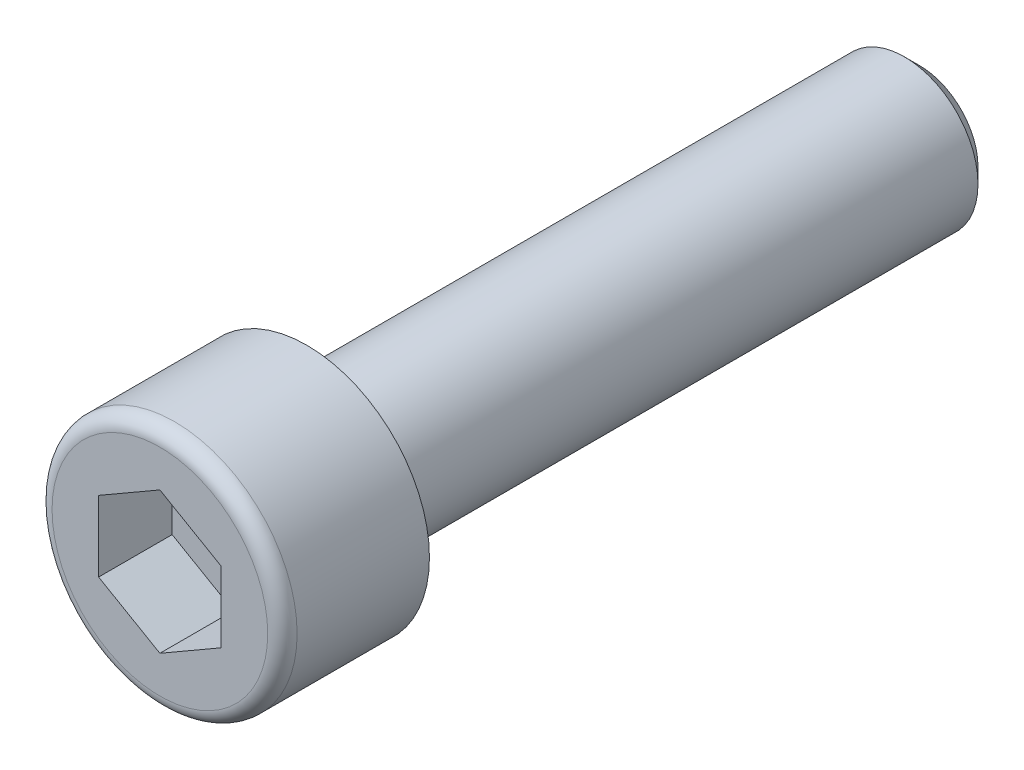
ISO-10303-21;
HEADER;
FILE_DESCRIPTION(('STEP AP214'),'2;1');
FILE_NAME('part.step','',(''),(''),'','','');
FILE_SCHEMA(('AUTOMOTIVE_DESIGN { 1 0 10303 214 1 1 1 1 }'));
ENDSEC;
DATA;
#1=APPLICATION_CONTEXT('core data for automotive mechanical design processes');
#2=APPLICATION_PROTOCOL_DEFINITION('international standard','automotive_design',2000,#1);
#3=PRODUCT_CONTEXT('',#1,'mechanical');
#4=PRODUCT('Part','Part','',(#3));
#5=PRODUCT_RELATED_PRODUCT_CATEGORY('part','',(#4));
#6=PRODUCT_DEFINITION_FORMATION('','',#4);
#7=PRODUCT_DEFINITION_CONTEXT('part definition',#1,'design');
#8=PRODUCT_DEFINITION('design','',#6,#7);
#9=PRODUCT_DEFINITION_SHAPE('','',#8);
#10=(LENGTH_UNIT() NAMED_UNIT(*) SI_UNIT(.MILLI.,.METRE.));
#11=(NAMED_UNIT(*) PLANE_ANGLE_UNIT() SI_UNIT($,.RADIAN.));
#12=(NAMED_UNIT(*) SI_UNIT($,.STERADIAN.) SOLID_ANGLE_UNIT());
#13=UNCERTAINTY_MEASURE_WITH_UNIT(LENGTH_MEASURE(1.E-05),#10,'distance_accuracy_value','');
#14=(GEOMETRIC_REPRESENTATION_CONTEXT(3) GLOBAL_UNCERTAINTY_ASSIGNED_CONTEXT((#13)) GLOBAL_UNIT_ASSIGNED_CONTEXT((#10,
#11,#12)) REPRESENTATION_CONTEXT('',''));
#15=CARTESIAN_POINT('',(0.,0.,0.));
#16=DIRECTION('',(0.,0.,1.));
#17=DIRECTION('',(1.,0.,0.));
#18=AXIS2_PLACEMENT_3D('',#15,#16,#17);
#19=CARTESIAN_POINT('',(0.,0.,3.));
#20=DIRECTION('',(0.,0.,-1.));
#21=DIRECTION('',(-1.,0.,0.));
#22=AXIS2_PLACEMENT_3D('',#19,#20,#21);
#23=PLANE('',#22);
#24=DIRECTION('',(0.866025403795548,-0.499999999980758,0.));
#25=VECTOR('',#24,1.);
#26=CARTESIAN_POINT('',(-1.25,-2.16506350945,3.));
#27=LINE('',#26,#25);
#28=CARTESIAN_POINT('',(-2.5,-1.443375673,3.));
#29=VERTEX_POINT('',#28);
#30=CARTESIAN_POINT('',(0.,-2.8867513459,3.));
#31=VERTEX_POINT('',#30);
#32=EDGE_CURVE('E193',#29,#31,#27,.T.);
#33=ORIENTED_EDGE('',*,*,#32,.T.);
#34=DIRECTION('',(0.866025403795548,0.499999999980758,0.));
#35=VECTOR('',#34,1.);
#36=CARTESIAN_POINT('',(1.25,-2.16506350945,3.));
#37=LINE('',#36,#35);
#38=CARTESIAN_POINT('',(2.5,-1.443375673,3.));
#39=VERTEX_POINT('',#38);
#40=EDGE_CURVE('E204',#31,#39,#37,.T.);
#41=ORIENTED_EDGE('',*,*,#40,.T.);
#42=DIRECTION('',(0.,1.,0.));
#43=VECTOR('',#42,1.);
#44=CARTESIAN_POINT('',(2.5,0.7216878365,3.));
#45=LINE('',#44,#43);
#46=CARTESIAN_POINT('',(2.5,1.443375673,3.));
#47=VERTEX_POINT('',#46);
#48=EDGE_CURVE('E209',#39,#47,#45,.T.);
#49=ORIENTED_EDGE('',*,*,#48,.T.);
#50=DIRECTION('',(-0.866025403795548,0.499999999980758,0.));
#51=VECTOR('',#50,1.);
#52=CARTESIAN_POINT('',(1.25,2.16506350945,3.));
#53=LINE('',#52,#51);
#54=CARTESIAN_POINT('',(0.,2.8867513459,3.));
#55=VERTEX_POINT('',#54);
#56=EDGE_CURVE('E96',#47,#55,#53,.T.);
#57=ORIENTED_EDGE('',*,*,#56,.T.);
#58=DIRECTION('',(-0.866025403795548,-0.499999999980758,0.));
#59=VECTOR('',#58,1.);
#60=CARTESIAN_POINT('',(-1.25,2.16506350945,3.));
#61=LINE('',#60,#59);
#62=CARTESIAN_POINT('',(-2.5,1.443375673,3.));
#63=VERTEX_POINT('',#62);
#64=EDGE_CURVE('E80',#55,#63,#61,.T.);
#65=ORIENTED_EDGE('',*,*,#64,.T.);
#66=DIRECTION('',(0.,1.,0.));
#67=VECTOR('',#66,1.);
#68=CARTESIAN_POINT('',(-2.5,0.,3.));
#69=LINE('',#68,#67);
#70=EDGE_CURVE('E85',#63,#29,#69,.F.);
#71=ORIENTED_EDGE('',*,*,#70,.T.);
#72=EDGE_LOOP('',(#33,#41,#49,#57,#65,#71));
#73=FACE_BOUND('',#72,.T.);
#74=ADVANCED_FACE('F16',(#73),#23,.F.);
#75=CARTESIAN_POINT('',(-2.5,0.,6.));
#76=DIRECTION('',(-1.,0.,0.));
#77=DIRECTION('',(0.,0.,1.));
#78=AXIS2_PLACEMENT_3D('',#75,#76,#77);
#79=PLANE('',#78);
#80=DIRECTION('',(0.,0.,1.));
#81=VECTOR('',#80,1.);
#82=CARTESIAN_POINT('',(-2.5,1.443375673,6.));
#83=LINE('',#82,#81);
#84=CARTESIAN_POINT('',(-2.5,1.443375673,6.));
#85=VERTEX_POINT('',#84);
#86=EDGE_CURVE('E87',#63,#85,#83,.T.);
#87=ORIENTED_EDGE('',*,*,#86,.T.);
#88=DIRECTION('',(0.,1.,0.));
#89=VECTOR('',#88,1.);
#90=CARTESIAN_POINT('',(-2.5,0.,6.));
#91=LINE('',#90,#89);
#92=CARTESIAN_POINT('',(-2.5,-1.443375673,6.));
#93=VERTEX_POINT('',#92);
#94=EDGE_CURVE('E200',#93,#85,#91,.T.);
#95=ORIENTED_EDGE('',*,*,#94,.F.);
#96=DIRECTION('',(0.,0.,1.));
#97=VECTOR('',#96,1.);
#98=CARTESIAN_POINT('',(-2.5,-1.443375673,6.));
#99=LINE('',#98,#97);
#100=EDGE_CURVE('E90',#93,#29,#99,.F.);
#101=ORIENTED_EDGE('',*,*,#100,.T.);
#102=ORIENTED_EDGE('',*,*,#70,.F.);
#103=EDGE_LOOP('',(#87,#95,#101,#102));
#104=FACE_BOUND('',#103,.T.);
#105=ADVANCED_FACE('F86',(#104),#79,.F.);
#106=CARTESIAN_POINT('',(-1.25,2.16506350945,6.));
#107=DIRECTION('',(-0.499999999980758,0.866025403795548,0.));
#108=DIRECTION('',(-0.866025403795548,-0.499999999980758,0.));
#109=AXIS2_PLACEMENT_3D('',#106,#107,#108);
#110=PLANE('',#109);
#111=DIRECTION('',(0.,0.,1.));
#112=VECTOR('',#111,1.);
#113=CARTESIAN_POINT('',(0.,2.8867513459,6.));
#114=LINE('',#113,#112);
#115=CARTESIAN_POINT('',(0.,2.8867513459,6.));
#116=VERTEX_POINT('',#115);
#117=EDGE_CURVE('E98',#55,#116,#114,.T.);
#118=ORIENTED_EDGE('',*,*,#117,.T.);
#119=DIRECTION('',(0.866025403795548,0.499999999980758,0.));
#120=VECTOR('',#119,1.);
#121=CARTESIAN_POINT('',(-2.5,1.443375673,6.));
#122=LINE('',#121,#120);
#123=EDGE_CURVE('E102',#85,#116,#122,.T.);
#124=ORIENTED_EDGE('',*,*,#123,.F.);
#125=ORIENTED_EDGE('',*,*,#86,.F.);
#126=ORIENTED_EDGE('',*,*,#64,.F.);
#127=EDGE_LOOP('',(#118,#124,#125,#126));
#128=FACE_BOUND('',#127,.T.);
#129=ADVANCED_FACE('F100',(#128),#110,.F.);
#130=CARTESIAN_POINT('',(1.25,2.16506350945,6.));
#131=DIRECTION('',(0.499999999980758,0.866025403795548,0.));
#132=DIRECTION('',(-0.866025403795548,0.499999999980758,0.));
#133=AXIS2_PLACEMENT_3D('',#130,#131,#132);
#134=PLANE('',#133);
#135=DIRECTION('',(0.,0.,-1.));
#136=VECTOR('',#135,1.);
#137=CARTESIAN_POINT('',(2.5,1.443375673,6.));
#138=LINE('',#137,#136);
#139=CARTESIAN_POINT('',(2.5,1.443375673,6.));
#140=VERTEX_POINT('',#139);
#141=EDGE_CURVE('E211',#47,#140,#138,.F.);
#142=ORIENTED_EDGE('',*,*,#141,.T.);
#143=DIRECTION('',(0.866025403795548,-0.499999999980758,0.));
#144=VECTOR('',#143,1.);
#145=CARTESIAN_POINT('',(0.,2.8867513459,6.));
#146=LINE('',#145,#144);
#147=EDGE_CURVE('E216',#116,#140,#146,.T.);
#148=ORIENTED_EDGE('',*,*,#147,.F.);
#149=ORIENTED_EDGE('',*,*,#117,.F.);
#150=ORIENTED_EDGE('',*,*,#56,.F.);
#151=EDGE_LOOP('',(#142,#148,#149,#150));
#152=FACE_BOUND('',#151,.T.);
#153=ADVANCED_FACE('F217',(#152),#134,.F.);
#154=CARTESIAN_POINT('',(2.5,0.7216878365,6.));
#155=DIRECTION('',(1.,0.,0.));
#156=DIRECTION('',(0.,0.,-1.));
#157=AXIS2_PLACEMENT_3D('',#154,#155,#156);
#158=PLANE('',#157);
#159=DIRECTION('',(0.,0.,1.));
#160=VECTOR('',#159,1.);
#161=CARTESIAN_POINT('',(2.5,-1.443375673,6.));
#162=LINE('',#161,#160);
#163=CARTESIAN_POINT('',(2.5,-1.443375673,6.));
#164=VERTEX_POINT('',#163);
#165=EDGE_CURVE('E207',#39,#164,#162,.T.);
#166=ORIENTED_EDGE('',*,*,#165,.T.);
#167=DIRECTION('',(0.,1.,0.));
#168=VECTOR('',#167,1.);
#169=CARTESIAN_POINT('',(2.5,0.,6.));
#170=LINE('',#169,#168);
#171=EDGE_CURVE('E222',#140,#164,#170,.F.);
#172=ORIENTED_EDGE('',*,*,#171,.F.);
#173=ORIENTED_EDGE('',*,*,#141,.F.);
#174=ORIENTED_EDGE('',*,*,#48,.F.);
#175=EDGE_LOOP('',(#166,#172,#173,#174));
#176=FACE_BOUND('',#175,.T.);
#177=ADVANCED_FACE('F347',(#176),#158,.F.);
#178=CARTESIAN_POINT('',(1.25,-2.16506350945,6.));
#179=DIRECTION('',(0.499999999980758,-0.866025403795548,0.));
#180=DIRECTION('',(0.866025403795548,0.499999999980758,0.));
#181=AXIS2_PLACEMENT_3D('',#178,#179,#180);
#182=PLANE('',#181);
#183=DIRECTION('',(0.,0.,1.));
#184=VECTOR('',#183,1.);
#185=CARTESIAN_POINT('',(0.,-2.8867513459,6.));
#186=LINE('',#185,#184);
#187=CARTESIAN_POINT('',(0.,-2.8867513459,6.));
#188=VERTEX_POINT('',#187);
#189=EDGE_CURVE('E202',#31,#188,#186,.T.);
#190=ORIENTED_EDGE('',*,*,#189,.T.);
#191=DIRECTION('',(-0.866025403795548,-0.499999999980758,0.));
#192=VECTOR('',#191,1.);
#193=CARTESIAN_POINT('',(2.5,-1.443375673,6.));
#194=LINE('',#193,#192);
#195=EDGE_CURVE('E229',#164,#188,#194,.T.);
#196=ORIENTED_EDGE('',*,*,#195,.F.);
#197=ORIENTED_EDGE('',*,*,#165,.F.);
#198=ORIENTED_EDGE('',*,*,#40,.F.);
#199=EDGE_LOOP('',(#190,#196,#197,#198));
#200=FACE_BOUND('',#199,.T.);
#201=ADVANCED_FACE('F338',(#200),#182,.F.);
#202=CARTESIAN_POINT('',(-1.25,-2.16506350945,6.));
#203=DIRECTION('',(-0.499999999980758,-0.866025403795548,0.));
#204=DIRECTION('',(0.866025403795548,-0.499999999980758,0.));
#205=AXIS2_PLACEMENT_3D('',#202,#203,#204);
#206=PLANE('',#205);
#207=ORIENTED_EDGE('',*,*,#100,.F.);
#208=DIRECTION('',(-0.866025403795548,0.499999999980758,0.));
#209=VECTOR('',#208,1.);
#210=CARTESIAN_POINT('',(0.,-2.8867513459,6.));
#211=LINE('',#210,#209);
#212=EDGE_CURVE('E231',#188,#93,#211,.T.);
#213=ORIENTED_EDGE('',*,*,#212,.F.);
#214=ORIENTED_EDGE('',*,*,#189,.F.);
#215=ORIENTED_EDGE('',*,*,#32,.F.);
#216=EDGE_LOOP('',(#207,#213,#214,#215));
#217=FACE_BOUND('',#216,.T.);
#218=ADVANCED_FACE('F330',(#217),#206,.F.);
#219=CARTESIAN_POINT('',(2.2,0.,6.));
#220=DIRECTION('',(0.,0.,1.));
#221=DIRECTION('',(1.,0.,0.));
#222=AXIS2_PLACEMENT_3D('',#219,#220,#221);
#223=PLANE('',#222);
#224=CARTESIAN_POINT('',(0.,0.,6.));
#225=DIRECTION('',(0.,0.,-1.));
#226=DIRECTION('',(1.,0.,0.));
#227=AXIS2_PLACEMENT_3D('',#224,#225,#226);
#228=CIRCLE('',#227,4.4);
#229=CARTESIAN_POINT('',(4.4,0.,6.));
#230=VERTEX_POINT('',#229);
#231=CARTESIAN_POINT('',(-4.4,0.,6.));
#232=VERTEX_POINT('',#231);
#233=EDGE_CURVE('E233',#230,#232,#228,.T.);
#234=ORIENTED_EDGE('',*,*,#233,.F.);
#235=CARTESIAN_POINT('',(0.,0.,6.));
#236=DIRECTION('',(0.,0.,-1.));
#237=DIRECTION('',(-1.,0.,0.));
#238=AXIS2_PLACEMENT_3D('',#235,#236,#237);
#239=CIRCLE('',#238,4.4);
#240=EDGE_CURVE('E245',#232,#230,#239,.T.);
#241=ORIENTED_EDGE('',*,*,#240,.F.);
#242=EDGE_LOOP('',(#234,#241));
#243=FACE_BOUND('',#242,.T.);
#244=ORIENTED_EDGE('',*,*,#195,.T.);
#245=ORIENTED_EDGE('',*,*,#212,.T.);
#246=ORIENTED_EDGE('',*,*,#94,.T.);
#247=ORIENTED_EDGE('',*,*,#123,.T.);
#248=ORIENTED_EDGE('',*,*,#147,.T.);
#249=ORIENTED_EDGE('',*,*,#171,.T.);
#250=EDGE_LOOP('',(#244,#245,#246,#247,#248,#249));
#251=FACE_BOUND('',#250,.T.);
#252=ADVANCED_FACE('F181',(#243,#251),#223,.T.);
#253=CARTESIAN_POINT('',(0.,0.,5.4));
#254=DIRECTION('',(0.,0.,-1.));
#255=DIRECTION('',(-1.,0.,0.));
#256=AXIS2_PLACEMENT_3D('',#253,#254,#255);
#257=TOROIDAL_SURFACE('',#256,4.4,0.600000000000003);
#258=ORIENTED_EDGE('',*,*,#233,.T.);
#259=ORIENTED_EDGE('',*,*,#240,.T.);
#260=EDGE_LOOP('',(#258,#259));
#261=FACE_BOUND('',#260,.T.);
#262=CARTESIAN_POINT('',(0.,0.,5.4));
#263=DIRECTION('',(0.,0.,-1.));
#264=DIRECTION('',(-1.,0.,0.));
#265=AXIS2_PLACEMENT_3D('',#262,#263,#264);
#266=CIRCLE('',#265,5.);
#267=CARTESIAN_POINT('',(-5.,0.,5.4));
#268=VERTEX_POINT('',#267);
#269=EDGE_CURVE('E118',#268,#268,#266,.T.);
#270=ORIENTED_EDGE('',*,*,#269,.F.);
#271=EDGE_LOOP('',(#270));
#272=FACE_BOUND('',#271,.T.);
#273=ADVANCED_FACE('F176',(#261,#272),#257,.T.);
#274=CARTESIAN_POINT('',(0.,0.,2.7));
#275=DIRECTION('',(0.,0.,-1.));
#276=DIRECTION('',(-1.,0.,0.));
#277=AXIS2_PLACEMENT_3D('',#274,#275,#276);
#278=CYLINDRICAL_SURFACE('',#277,5.);
#279=CARTESIAN_POINT('',(0.,0.,0.));
#280=DIRECTION('',(0.,0.,-1.));
#281=DIRECTION('',(-1.,0.,0.));
#282=AXIS2_PLACEMENT_3D('',#279,#280,#281);
#283=CIRCLE('',#282,5.);
#284=CARTESIAN_POINT('',(-5.,0.,0.));
#285=VERTEX_POINT('',#284);
#286=EDGE_CURVE('E114',#285,#285,#283,.T.);
#287=ORIENTED_EDGE('',*,*,#286,.F.);
#288=EDGE_LOOP('',(#287));
#289=FACE_BOUND('',#288,.T.);
#290=ORIENTED_EDGE('',*,*,#269,.T.);
#291=EDGE_LOOP('',(#290));
#292=FACE_BOUND('',#291,.T.);
#293=ADVANCED_FACE('F180',(#289,#292),#278,.T.);
#294=CARTESIAN_POINT('',(4.,0.,0.));
#295=DIRECTION('',(0.,0.,-1.));
#296=DIRECTION('',(-1.,0.,0.));
#297=AXIS2_PLACEMENT_3D('',#294,#295,#296);
#298=PLANE('',#297);
#299=ORIENTED_EDGE('',*,*,#286,.T.);
#300=EDGE_LOOP('',(#299));
#301=FACE_BOUND('',#300,.T.);
#302=CARTESIAN_POINT('',(0.,0.,0.));
#303=DIRECTION('',(0.,0.,-1.));
#304=DIRECTION('',(-1.,0.,0.));
#305=AXIS2_PLACEMENT_3D('',#302,#303,#304);
#306=CIRCLE('',#305,3.26);
#307=CARTESIAN_POINT('',(3.26,0.,0.));
#308=VERTEX_POINT('',#307);
#309=CARTESIAN_POINT('',(-3.26,0.,0.));
#310=VERTEX_POINT('',#309);
#311=EDGE_CURVE('E35',#308,#310,#306,.F.);
#312=ORIENTED_EDGE('',*,*,#311,.T.);
#313=CARTESIAN_POINT('',(0.,0.,0.));
#314=DIRECTION('',(0.,0.,-1.));
#315=DIRECTION('',(1.,0.,0.));
#316=AXIS2_PLACEMENT_3D('',#313,#314,#315);
#317=CIRCLE('',#316,3.26);
#318=EDGE_CURVE('E117',#310,#308,#317,.F.);
#319=ORIENTED_EDGE('',*,*,#318,.T.);
#320=EDGE_LOOP('',(#312,#319));
#321=FACE_BOUND('',#320,.T.);
#322=ADVANCED_FACE('F136',(#301,#321),#298,.T.);
#323=CARTESIAN_POINT('',(0.,0.,-0.25));
#324=DIRECTION('',(0.,0.,-1.));
#325=DIRECTION('',(1.,0.,0.));
#326=AXIS2_PLACEMENT_3D('',#323,#324,#325);
#327=TOROIDAL_SURFACE('',#326,3.26,0.25);
#328=CARTESIAN_POINT('',(0.,0.,-0.25));
#329=DIRECTION('',(0.,0.,-1.));
#330=DIRECTION('',(-1.,0.,0.));
#331=AXIS2_PLACEMENT_3D('',#328,#329,#330);
#332=CIRCLE('',#331,3.01);
#333=CARTESIAN_POINT('',(-3.01,0.,-0.25));
#334=VERTEX_POINT('',#333);
#335=EDGE_CURVE('E113',#334,#334,#332,.T.);
#336=ORIENTED_EDGE('',*,*,#335,.F.);
#337=EDGE_LOOP('',(#336));
#338=FACE_BOUND('',#337,.T.);
#339=ORIENTED_EDGE('',*,*,#318,.F.);
#340=ORIENTED_EDGE('',*,*,#311,.F.);
#341=EDGE_LOOP('',(#339,#340));
#342=FACE_BOUND('',#341,.T.);
#343=ADVANCED_FACE('F124',(#338,#342),#327,.F.);
#344=CARTESIAN_POINT('',(0.,0.,-25.));
#345=DIRECTION('',(0.,0.,-1.));
#346=DIRECTION('',(-1.,0.,0.));
#347=AXIS2_PLACEMENT_3D('',#344,#345,#346);
#348=PLANE('',#347);
#349=CARTESIAN_POINT('',(0.,0.,-24.9999999999773));
#350=DIRECTION('',(0.,0.,1.));
#351=DIRECTION('',(1.,0.,0.));
#352=AXIS2_PLACEMENT_3D('',#349,#350,#351);
#353=CIRCLE('',#352,2.38500000011754);
#354=CARTESIAN_POINT('',(2.38500000011754,0.,-24.9999999999773));
#355=VERTEX_POINT('',#354);
#356=EDGE_CURVE('E110',#355,#355,#353,.T.);
#357=ORIENTED_EDGE('',*,*,#356,.F.);
#358=EDGE_LOOP('',(#357));
#359=FACE_BOUND('',#358,.T.);
#360=ADVANCED_FACE('F135',(#359),#348,.T.);
#361=CARTESIAN_POINT('',(0.,0.,-0.5));
#362=DIRECTION('',(0.,0.,-1.));
#363=DIRECTION('',(-1.,0.,0.));
#364=AXIS2_PLACEMENT_3D('',#361,#362,#363);
#365=CYLINDRICAL_SURFACE('',#364,3.01);
#366=CARTESIAN_POINT('',(0.,0.,-1.));
#367=DIRECTION('',(0.,0.,-1.));
#368=DIRECTION('',(-1.,0.,0.));
#369=AXIS2_PLACEMENT_3D('',#366,#367,#368);
#370=CIRCLE('',#369,3.01);
#371=CARTESIAN_POINT('',(-3.01,0.,-1.));
#372=VERTEX_POINT('',#371);
#373=EDGE_CURVE('E107',#372,#372,#370,.T.);
#374=ORIENTED_EDGE('',*,*,#373,.F.);
#375=EDGE_LOOP('',(#374));
#376=FACE_BOUND('',#375,.T.);
#377=ORIENTED_EDGE('',*,*,#335,.T.);
#378=EDGE_LOOP('',(#377));
#379=FACE_BOUND('',#378,.T.);
#380=ADVANCED_FACE('F280',(#376,#379),#365,.T.);
#381=CARTESIAN_POINT('',(0.,0.,-24.3850000001089));
#382=DIRECTION('',(0.,0.,1.));
#383=DIRECTION('',(1.,0.,0.));
#384=AXIS2_PLACEMENT_3D('',#381,#382,#383);
#385=CONICAL_SURFACE('',#384,2.9999999999859,0.785398163397448);
#386=ORIENTED_EDGE('',*,*,#356,.T.);
#387=EDGE_LOOP('',(#386));
#388=FACE_BOUND('',#387,.T.);
#389=CARTESIAN_POINT('',(0.,0.,-24.385));
#390=DIRECTION('',(0.,0.,1.));
#391=DIRECTION('',(1.,0.,0.));
#392=AXIS2_PLACEMENT_3D('',#389,#390,#391);
#393=CIRCLE('',#392,3.);
#394=CARTESIAN_POINT('',(3.,0.,-24.385));
#395=VERTEX_POINT('',#394);
#396=EDGE_CURVE('E27',#395,#395,#393,.T.);
#397=ORIENTED_EDGE('',*,*,#396,.F.);
#398=EDGE_LOOP('',(#397));
#399=FACE_BOUND('',#398,.T.);
#400=ADVANCED_FACE('F273',(#388,#399),#385,.T.);
#401=CARTESIAN_POINT('',(1.5,0.,-1.));
#402=DIRECTION('',(0.,0.,-1.));
#403=DIRECTION('',(-1.,0.,0.));
#404=AXIS2_PLACEMENT_3D('',#401,#402,#403);
#405=PLANE('',#404);
#406=ORIENTED_EDGE('',*,*,#373,.T.);
#407=EDGE_LOOP('',(#406));
#408=FACE_BOUND('',#407,.T.);
#409=CARTESIAN_POINT('',(0.,0.,-0.999999999999999));
#410=DIRECTION('',(0.,0.,1.));
#411=DIRECTION('',(1.,0.,0.));
#412=AXIS2_PLACEMENT_3D('',#409,#410,#411);
#413=CIRCLE('',#412,3.);
#414=CARTESIAN_POINT('',(3.,0.,-0.999999999999999));
#415=VERTEX_POINT('',#414);
#416=EDGE_CURVE('E10',#415,#415,#413,.F.);
#417=ORIENTED_EDGE('',*,*,#416,.F.);
#418=EDGE_LOOP('',(#417));
#419=FACE_BOUND('',#418,.T.);
#420=ADVANCED_FACE('F267',(#408,#419),#405,.T.);
#421=CARTESIAN_POINT('',(0.,0.,-12.6925));
#422=DIRECTION('',(0.,0.,1.));
#423=DIRECTION('',(1.,0.,0.));
#424=AXIS2_PLACEMENT_3D('',#421,#422,#423);
#425=CYLINDRICAL_SURFACE('',#424,3.);
#426=ORIENTED_EDGE('',*,*,#396,.T.);
#427=EDGE_LOOP('',(#426));
#428=FACE_BOUND('',#427,.T.);
#429=ORIENTED_EDGE('',*,*,#416,.T.);
#430=EDGE_LOOP('',(#429));
#431=FACE_BOUND('',#430,.T.);
#432=ADVANCED_FACE('F265',(#428,#431),#425,.T.);
#433=CLOSED_SHELL('',(#74,#105,#129,#153,#177,#201,#218,#252,#273,#293,#322,#343,#360,#380,#400,
#420,#432));
#434=MANIFOLD_SOLID_BREP('B1',#433);
#435=ADVANCED_BREP_SHAPE_REPRESENTATION('',(#18,#434),#14);
#436=SHAPE_DEFINITION_REPRESENTATION(#9,#435);
ENDSEC;
END-ISO-10303-21;
